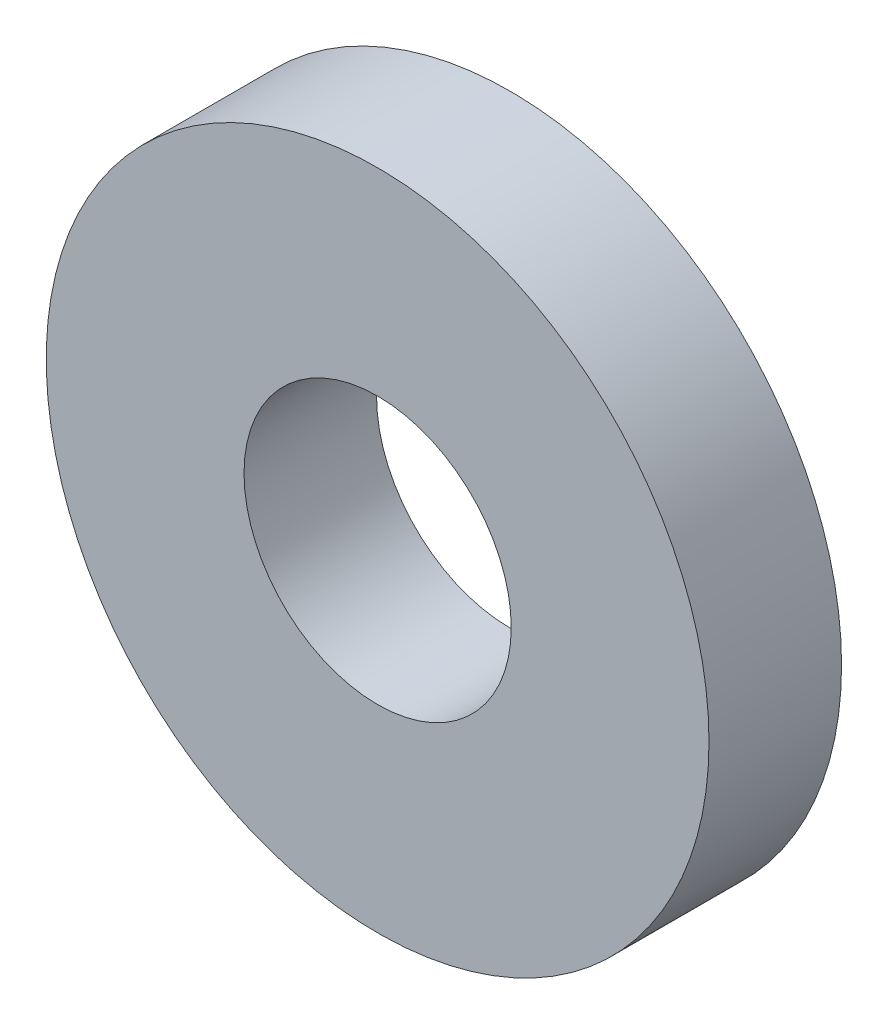
ISO-10303-21;
HEADER;
FILE_DESCRIPTION(('STEP AP214'),'2;1');
FILE_NAME('part.step','',(''),(''),'','','');
FILE_SCHEMA(('AUTOMOTIVE_DESIGN { 1 0 10303 214 1 1 1 1 }'));
ENDSEC;
DATA;
#1=APPLICATION_CONTEXT('core data for automotive mechanical design processes');
#2=APPLICATION_PROTOCOL_DEFINITION('international standard','automotive_design',2000,#1);
#3=PRODUCT_CONTEXT('',#1,'mechanical');
#4=PRODUCT('Part','Part','',(#3));
#5=PRODUCT_RELATED_PRODUCT_CATEGORY('part','',(#4));
#6=PRODUCT_DEFINITION_FORMATION('','',#4);
#7=PRODUCT_DEFINITION_CONTEXT('part definition',#1,'design');
#8=PRODUCT_DEFINITION('design','',#6,#7);
#9=PRODUCT_DEFINITION_SHAPE('','',#8);
#10=(LENGTH_UNIT() NAMED_UNIT(*) SI_UNIT(.MILLI.,.METRE.));
#11=(NAMED_UNIT(*) PLANE_ANGLE_UNIT() SI_UNIT($,.RADIAN.));
#12=(NAMED_UNIT(*) SI_UNIT($,.STERADIAN.) SOLID_ANGLE_UNIT());
#13=UNCERTAINTY_MEASURE_WITH_UNIT(LENGTH_MEASURE(1.E-05),#10,'distance_accuracy_value','');
#14=(GEOMETRIC_REPRESENTATION_CONTEXT(3) GLOBAL_UNCERTAINTY_ASSIGNED_CONTEXT((#13)) GLOBAL_UNIT_ASSIGNED_CONTEXT((#10,
#11,#12)) REPRESENTATION_CONTEXT('',''));
#15=CARTESIAN_POINT('',(0.,0.,0.));
#16=DIRECTION('',(0.,0.,1.));
#17=DIRECTION('',(1.,0.,0.));
#18=AXIS2_PLACEMENT_3D('',#15,#16,#17);
#19=CARTESIAN_POINT('',(0.,0.,1.5875));
#20=DIRECTION('',(0.,0.,1.));
#21=DIRECTION('',(1.,0.,0.));
#22=AXIS2_PLACEMENT_3D('',#19,#20,#21);
#23=PLANE('',#22);
#24=CARTESIAN_POINT('',(0.,0.,1.5875));
#25=DIRECTION('',(0.,0.,1.));
#26=DIRECTION('',(1.,0.,0.));
#27=AXIS2_PLACEMENT_3D('',#24,#25,#26);
#28=CIRCLE('',#27,7.9375);
#29=CARTESIAN_POINT('',(7.9375,0.,1.5875));
#30=VERTEX_POINT('',#29);
#31=EDGE_CURVE('E10',#30,#30,#28,.T.);
#32=ORIENTED_EDGE('',*,*,#31,.T.);
#33=EDGE_LOOP('',(#32));
#34=FACE_BOUND('',#33,.T.);
#35=CARTESIAN_POINT('',(0.,0.,1.5875));
#36=DIRECTION('',(0.,0.,1.));
#37=DIRECTION('',(1.,0.,0.));
#38=AXIS2_PLACEMENT_3D('',#35,#36,#37);
#39=CIRCLE('',#38,3.2004);
#40=CARTESIAN_POINT('',(3.2004,0.,1.5875));
#41=VERTEX_POINT('',#40);
#42=EDGE_CURVE('E44',#41,#41,#39,.T.);
#43=ORIENTED_EDGE('',*,*,#42,.F.);
#44=EDGE_LOOP('',(#43));
#45=FACE_BOUND('',#44,.T.);
#46=ADVANCED_FACE('F33',(#34,#45),#23,.T.);
#47=CARTESIAN_POINT('',(0.,0.,-1.5875));
#48=DIRECTION('',(0.,0.,1.));
#49=DIRECTION('',(1.,0.,0.));
#50=AXIS2_PLACEMENT_3D('',#47,#48,#49);
#51=PLANE('',#50);
#52=CARTESIAN_POINT('',(0.,0.,-1.5875));
#53=DIRECTION('',(0.,0.,1.));
#54=DIRECTION('',(1.,0.,0.));
#55=AXIS2_PLACEMENT_3D('',#52,#53,#54);
#56=CIRCLE('',#55,7.9375);
#57=CARTESIAN_POINT('',(7.9375,0.,-1.5875));
#58=VERTEX_POINT('',#57);
#59=EDGE_CURVE('E37',#58,#58,#56,.T.);
#60=ORIENTED_EDGE('',*,*,#59,.F.);
#61=EDGE_LOOP('',(#60));
#62=FACE_BOUND('',#61,.T.);
#63=CARTESIAN_POINT('',(0.,0.,-1.5875));
#64=DIRECTION('',(0.,0.,1.));
#65=DIRECTION('',(1.,0.,0.));
#66=AXIS2_PLACEMENT_3D('',#63,#64,#65);
#67=CIRCLE('',#66,3.2004);
#68=CARTESIAN_POINT('',(3.2004,0.,-1.5875));
#69=VERTEX_POINT('',#68);
#70=EDGE_CURVE('E46',#69,#69,#67,.T.);
#71=ORIENTED_EDGE('',*,*,#70,.T.);
#72=EDGE_LOOP('',(#71));
#73=FACE_BOUND('',#72,.T.);
#74=ADVANCED_FACE('F56',(#62,#73),#51,.F.);
#75=CARTESIAN_POINT('',(0.,0.,1.5875));
#76=DIRECTION('',(0.,0.,-1.));
#77=DIRECTION('',(-1.,0.,0.));
#78=AXIS2_PLACEMENT_3D('',#75,#76,#77);
#79=CYLINDRICAL_SURFACE('',#78,7.9375);
#80=ORIENTED_EDGE('',*,*,#31,.F.);
#81=EDGE_LOOP('',(#80));
#82=FACE_BOUND('',#81,.T.);
#83=ORIENTED_EDGE('',*,*,#59,.T.);
#84=EDGE_LOOP('',(#83));
#85=FACE_BOUND('',#84,.T.);
#86=ADVANCED_FACE('F35',(#82,#85),#79,.T.);
#87=CARTESIAN_POINT('',(0.,0.,1.5875));
#88=DIRECTION('',(0.,0.,-1.));
#89=DIRECTION('',(-1.,0.,0.));
#90=AXIS2_PLACEMENT_3D('',#87,#88,#89);
#91=CYLINDRICAL_SURFACE('',#90,3.2004);
#92=ORIENTED_EDGE('',*,*,#42,.T.);
#93=EDGE_LOOP('',(#92));
#94=FACE_BOUND('',#93,.T.);
#95=ORIENTED_EDGE('',*,*,#70,.F.);
#96=EDGE_LOOP('',(#95));
#97=FACE_BOUND('',#96,.T.);
#98=ADVANCED_FACE('F52',(#94,#97),#91,.F.);
#99=CLOSED_SHELL('',(#46,#74,#86,#98));
#100=MANIFOLD_SOLID_BREP('B2',#99);
#101=ADVANCED_BREP_SHAPE_REPRESENTATION('',(#18,#100),#14);
#102=SHAPE_DEFINITION_REPRESENTATION(#9,#101);
ENDSEC;
END-ISO-10303-21;
